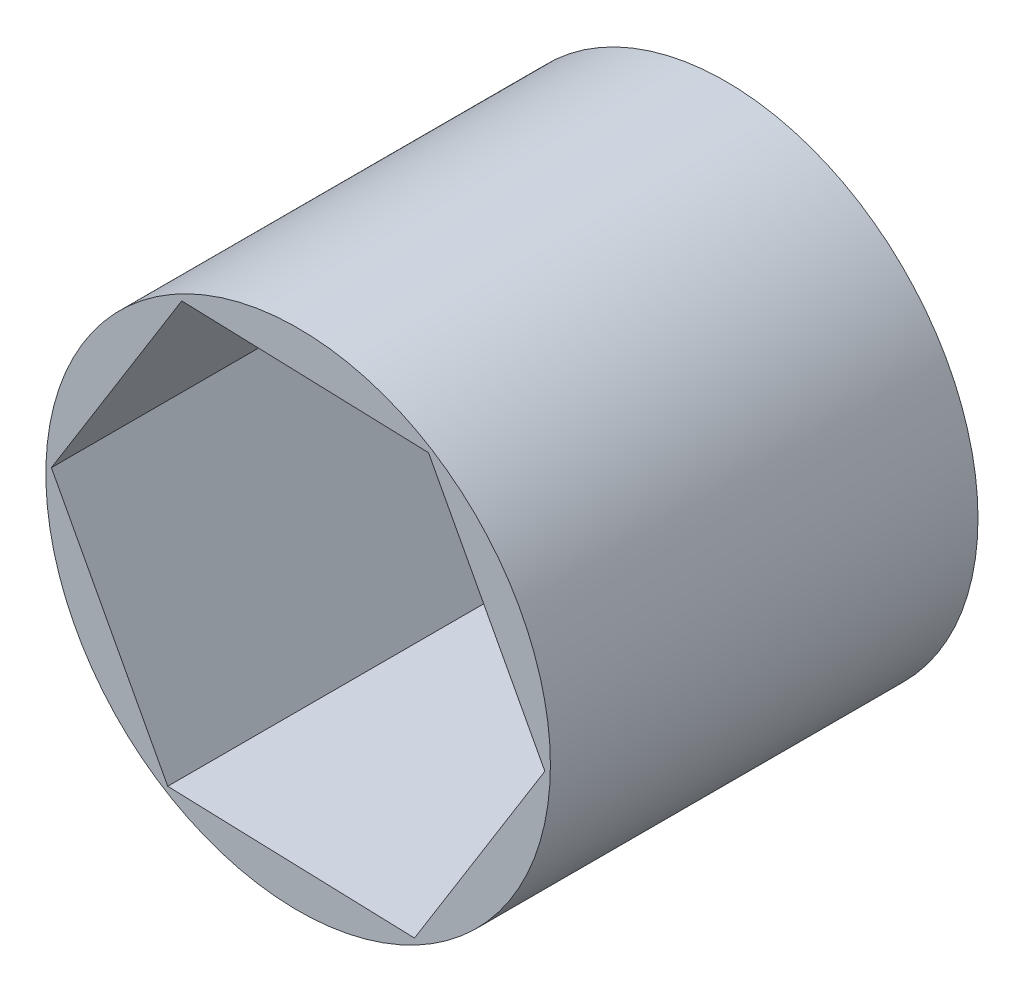
ISO-10303-21;
HEADER;
FILE_DESCRIPTION(('STEP AP214'),'2;1');
FILE_NAME('part.step','',(''),(''),'','','');
FILE_SCHEMA(('AUTOMOTIVE_DESIGN { 1 0 10303 214 1 1 1 1 }'));
ENDSEC;
DATA;
#1=APPLICATION_CONTEXT('core data for automotive mechanical design processes');
#2=APPLICATION_PROTOCOL_DEFINITION('international standard','automotive_design',2000,#1);
#3=PRODUCT_CONTEXT('',#1,'mechanical');
#4=PRODUCT('Part','Part','',(#3));
#5=PRODUCT_RELATED_PRODUCT_CATEGORY('part','',(#4));
#6=PRODUCT_DEFINITION_FORMATION('','',#4);
#7=PRODUCT_DEFINITION_CONTEXT('part definition',#1,'design');
#8=PRODUCT_DEFINITION('design','',#6,#7);
#9=PRODUCT_DEFINITION_SHAPE('','',#8);
#10=(LENGTH_UNIT() NAMED_UNIT(*) SI_UNIT(.MILLI.,.METRE.));
#11=(NAMED_UNIT(*) PLANE_ANGLE_UNIT() SI_UNIT($,.RADIAN.));
#12=(NAMED_UNIT(*) SI_UNIT($,.STERADIAN.) SOLID_ANGLE_UNIT());
#13=UNCERTAINTY_MEASURE_WITH_UNIT(LENGTH_MEASURE(1.E-05),#10,'distance_accuracy_value','');
#14=(GEOMETRIC_REPRESENTATION_CONTEXT(3) GLOBAL_UNCERTAINTY_ASSIGNED_CONTEXT((#13)) GLOBAL_UNIT_ASSIGNED_CONTEXT((#10,
#11,#12)) REPRESENTATION_CONTEXT('',''));
#15=CARTESIAN_POINT('',(0.,0.,0.));
#16=DIRECTION('',(0.,0.,1.));
#17=DIRECTION('',(1.,0.,0.));
#18=AXIS2_PLACEMENT_3D('',#15,#16,#17);
#19=CARTESIAN_POINT('',(0.,0.,12.7));
#20=DIRECTION('',(0.,0.,1.));
#21=DIRECTION('',(1.,0.,0.));
#22=AXIS2_PLACEMENT_3D('',#19,#20,#21);
#23=PLANE('',#22);
#24=CARTESIAN_POINT('',(0.,0.,12.7));
#25=DIRECTION('',(0.,0.,1.));
#26=DIRECTION('',(1.,0.,0.));
#27=AXIS2_PLACEMENT_3D('',#24,#25,#26);
#28=CIRCLE('',#27,7.493);
#29=CARTESIAN_POINT('',(7.493,0.,12.7));
#30=VERTEX_POINT('',#29);
#31=EDGE_CURVE('E11',#30,#30,#28,.T.);
#32=ORIENTED_EDGE('',*,*,#31,.T.);
#33=EDGE_LOOP('',(#32));
#34=FACE_BOUND('',#33,.T.);
#35=DIRECTION('',(-0.999461959203854,0.0327992698759279,0.));
#36=VECTOR('',#35,1.);
#37=CARTESIAN_POINT('',(3.87247702177585,6.2263356036397,12.7));
#38=LINE('',#37,#36);
#39=CARTESIAN_POINT('',(3.87247702177585,6.2263356036397,12.7));
#40=VERTEX_POINT('',#39);
#41=CARTESIAN_POINT('',(-3.45592629435157,6.46683127824924,12.7));
#42=VERTEX_POINT('',#41);
#43=EDGE_CURVE('E94',#40,#42,#38,.T.);
#44=ORIENTED_EDGE('',*,*,#43,.F.);
#45=DIRECTION('',(-0.471325978663792,0.881959081724667,0.));
#46=VECTOR('',#45,1.);
#47=CARTESIAN_POINT('',(7.32840331612742,-0.240495674609544,12.7));
#48=LINE('',#47,#46);
#49=CARTESIAN_POINT('',(7.32840331612742,-0.240495674609544,12.7));
#50=VERTEX_POINT('',#49);
#51=EDGE_CURVE('E86',#50,#40,#48,.T.);
#52=ORIENTED_EDGE('',*,*,#51,.F.);
#53=DIRECTION('',(0.528135980540062,0.84915981184874,0.));
#54=VECTOR('',#53,1.);
#55=CARTESIAN_POINT('',(3.45592629435157,-6.46683127824924,12.7));
#56=LINE('',#55,#54);
#57=CARTESIAN_POINT('',(3.45592629435157,-6.46683127824924,12.7));
#58=VERTEX_POINT('',#57);
#59=EDGE_CURVE('E114',#58,#50,#56,.T.);
#60=ORIENTED_EDGE('',*,*,#59,.F.);
#61=DIRECTION('',(0.999461959203854,-0.0327992698759277,0.));
#62=VECTOR('',#61,1.);
#63=CARTESIAN_POINT('',(-3.87247702177585,-6.2263356036397,12.7));
#64=LINE('',#63,#62);
#65=CARTESIAN_POINT('',(-3.87247702177585,-6.2263356036397,12.7));
#66=VERTEX_POINT('',#65);
#67=EDGE_CURVE('E112',#66,#58,#64,.T.);
#68=ORIENTED_EDGE('',*,*,#67,.F.);
#69=DIRECTION('',(0.471325978663792,-0.881959081724667,0.));
#70=VECTOR('',#69,1.);
#71=CARTESIAN_POINT('',(-7.32840331612743,0.240495674609547,12.7));
#72=LINE('',#71,#70);
#73=CARTESIAN_POINT('',(-7.32840331612743,0.240495674609547,12.7));
#74=VERTEX_POINT('',#73);
#75=EDGE_CURVE('E108',#74,#66,#72,.T.);
#76=ORIENTED_EDGE('',*,*,#75,.F.);
#77=DIRECTION('',(-0.528135980540062,-0.84915981184874,0.));
#78=VECTOR('',#77,1.);
#79=CARTESIAN_POINT('',(-3.45592629435157,6.46683127824924,12.7));
#80=LINE('',#79,#78);
#81=EDGE_CURVE('E106',#42,#74,#80,.T.);
#82=ORIENTED_EDGE('',*,*,#81,.F.);
#83=EDGE_LOOP('',(#44,#52,#60,#68,#76,#82));
#84=FACE_BOUND('',#83,.T.);
#85=ADVANCED_FACE('F33',(#34,#84),#23,.T.);
#86=CARTESIAN_POINT('',(0.,0.,0.));
#87=DIRECTION('',(0.,0.,1.));
#88=DIRECTION('',(1.,0.,0.));
#89=AXIS2_PLACEMENT_3D('',#86,#87,#88);
#90=PLANE('',#89);
#91=CARTESIAN_POINT('',(0.,0.,0.));
#92=DIRECTION('',(0.,0.,1.));
#93=DIRECTION('',(1.,0.,0.));
#94=AXIS2_PLACEMENT_3D('',#91,#92,#93);
#95=CIRCLE('',#94,7.493);
#96=CARTESIAN_POINT('',(7.493,0.,0.));
#97=VERTEX_POINT('',#96);
#98=EDGE_CURVE('E37',#97,#97,#95,.T.);
#99=ORIENTED_EDGE('',*,*,#98,.F.);
#100=EDGE_LOOP('',(#99));
#101=FACE_BOUND('',#100,.T.);
#102=DIRECTION('',(-0.471325978663792,0.881959081724667,0.));
#103=VECTOR('',#102,1.);
#104=CARTESIAN_POINT('',(7.32840331612742,-0.240495674609544,0.));
#105=LINE('',#104,#103);
#106=CARTESIAN_POINT('',(7.32840331612742,-0.240495674609543,0.));
#107=VERTEX_POINT('',#106);
#108=CARTESIAN_POINT('',(3.87247702177585,6.2263356036397,0.));
#109=VERTEX_POINT('',#108);
#110=EDGE_CURVE('E56',#107,#109,#105,.T.);
#111=ORIENTED_EDGE('',*,*,#110,.T.);
#112=DIRECTION('',(-0.999461959203854,0.0327992698759279,0.));
#113=VECTOR('',#112,1.);
#114=CARTESIAN_POINT('',(3.87247702177585,6.2263356036397,0.));
#115=LINE('',#114,#113);
#116=CARTESIAN_POINT('',(-3.45592629435157,6.46683127824924,0.));
#117=VERTEX_POINT('',#116);
#118=EDGE_CURVE('E101',#109,#117,#115,.T.);
#119=ORIENTED_EDGE('',*,*,#118,.T.);
#120=DIRECTION('',(-0.528135980540062,-0.84915981184874,0.));
#121=VECTOR('',#120,1.);
#122=CARTESIAN_POINT('',(-3.45592629435157,6.46683127824924,0.));
#123=LINE('',#122,#121);
#124=CARTESIAN_POINT('',(-7.32840331612743,0.240495674609547,0.));
#125=VERTEX_POINT('',#124);
#126=EDGE_CURVE('E118',#117,#125,#123,.T.);
#127=ORIENTED_EDGE('',*,*,#126,.T.);
#128=DIRECTION('',(0.471325978663792,-0.881959081724667,0.));
#129=VECTOR('',#128,1.);
#130=CARTESIAN_POINT('',(-7.32840331612743,0.240495674609547,0.));
#131=LINE('',#130,#129);
#132=CARTESIAN_POINT('',(-3.87247702177585,-6.2263356036397,0.));
#133=VERTEX_POINT('',#132);
#134=EDGE_CURVE('E121',#125,#133,#131,.T.);
#135=ORIENTED_EDGE('',*,*,#134,.T.);
#136=DIRECTION('',(0.999461959203854,-0.0327992698759277,0.));
#137=VECTOR('',#136,1.);
#138=CARTESIAN_POINT('',(-3.87247702177585,-6.2263356036397,0.));
#139=LINE('',#138,#137);
#140=CARTESIAN_POINT('',(3.45592629435157,-6.46683127824924,0.));
#141=VERTEX_POINT('',#140);
#142=EDGE_CURVE('E124',#133,#141,#139,.T.);
#143=ORIENTED_EDGE('',*,*,#142,.T.);
#144=DIRECTION('',(0.528135980540062,0.84915981184874,0.));
#145=VECTOR('',#144,1.);
#146=CARTESIAN_POINT('',(3.45592629435157,-6.46683127824924,0.));
#147=LINE('',#146,#145);
#148=EDGE_CURVE('E95',#141,#107,#147,.T.);
#149=ORIENTED_EDGE('',*,*,#148,.T.);
#150=EDGE_LOOP('',(#111,#119,#127,#135,#143,#149));
#151=FACE_BOUND('',#150,.T.);
#152=ADVANCED_FACE('F141',(#101,#151),#90,.F.);
#153=CARTESIAN_POINT('',(0.,0.,12.7));
#154=DIRECTION('',(0.,0.,-1.));
#155=DIRECTION('',(-1.,0.,0.));
#156=AXIS2_PLACEMENT_3D('',#153,#154,#155);
#157=CYLINDRICAL_SURFACE('',#156,7.493);
#158=ORIENTED_EDGE('',*,*,#31,.F.);
#159=EDGE_LOOP('',(#158));
#160=FACE_BOUND('',#159,.T.);
#161=ORIENTED_EDGE('',*,*,#98,.T.);
#162=EDGE_LOOP('',(#161));
#163=FACE_BOUND('',#162,.T.);
#164=ADVANCED_FACE('F35',(#160,#163),#157,.T.);
#165=CARTESIAN_POINT('',(7.32840331612742,-0.240495674609544,12.7));
#166=DIRECTION('',(-0.881959081724668,-0.471325978663792,0.));
#167=DIRECTION('',(0.471325978663792,-0.881959081724668,0.));
#168=AXIS2_PLACEMENT_3D('',#165,#166,#167);
#169=PLANE('',#168);
#170=ORIENTED_EDGE('',*,*,#110,.F.);
#171=DIRECTION('',(0.,0.,-1.));
#172=VECTOR('',#171,1.);
#173=CARTESIAN_POINT('',(7.32840331612742,-0.240495674609544,12.7));
#174=LINE('',#173,#172);
#175=EDGE_CURVE('E90',#50,#107,#174,.T.);
#176=ORIENTED_EDGE('',*,*,#175,.F.);
#177=ORIENTED_EDGE('',*,*,#51,.T.);
#178=DIRECTION('',(0.,0.,-1.));
#179=VECTOR('',#178,1.);
#180=CARTESIAN_POINT('',(3.87247702177585,6.2263356036397,12.7));
#181=LINE('',#180,#179);
#182=EDGE_CURVE('E89',#40,#109,#181,.T.);
#183=ORIENTED_EDGE('',*,*,#182,.T.);
#184=EDGE_LOOP('',(#170,#176,#177,#183));
#185=FACE_BOUND('',#184,.T.);
#186=ADVANCED_FACE('F88',(#185),#169,.T.);
#187=CARTESIAN_POINT('',(3.87247702177585,6.2263356036397,12.7));
#188=DIRECTION('',(-0.0327992698759279,-0.999461959203854,0.));
#189=DIRECTION('',(0.999461959203854,-0.0327992698759279,0.));
#190=AXIS2_PLACEMENT_3D('',#187,#188,#189);
#191=PLANE('',#190);
#192=ORIENTED_EDGE('',*,*,#118,.F.);
#193=ORIENTED_EDGE('',*,*,#182,.F.);
#194=ORIENTED_EDGE('',*,*,#43,.T.);
#195=DIRECTION('',(0.,0.,-1.));
#196=VECTOR('',#195,1.);
#197=CARTESIAN_POINT('',(-3.45592629435157,6.46683127824924,12.7));
#198=LINE('',#197,#196);
#199=EDGE_CURVE('E102',#42,#117,#198,.T.);
#200=ORIENTED_EDGE('',*,*,#199,.T.);
#201=EDGE_LOOP('',(#192,#193,#194,#200));
#202=FACE_BOUND('',#201,.T.);
#203=ADVANCED_FACE('F98',(#202),#191,.T.);
#204=CARTESIAN_POINT('',(-3.45592629435157,6.46683127824924,12.7));
#205=DIRECTION('',(0.84915981184874,-0.528135980540062,0.));
#206=DIRECTION('',(0.528135980540062,0.84915981184874,0.));
#207=AXIS2_PLACEMENT_3D('',#204,#205,#206);
#208=PLANE('',#207);
#209=ORIENTED_EDGE('',*,*,#126,.F.);
#210=ORIENTED_EDGE('',*,*,#199,.F.);
#211=ORIENTED_EDGE('',*,*,#81,.T.);
#212=DIRECTION('',(0.,0.,-1.));
#213=VECTOR('',#212,1.);
#214=CARTESIAN_POINT('',(-7.32840331612743,0.240495674609547,12.7));
#215=LINE('',#214,#213);
#216=EDGE_CURVE('E133',#74,#125,#215,.T.);
#217=ORIENTED_EDGE('',*,*,#216,.T.);
#218=EDGE_LOOP('',(#209,#210,#211,#217));
#219=FACE_BOUND('',#218,.T.);
#220=ADVANCED_FACE('F137',(#219),#208,.T.);
#221=CARTESIAN_POINT('',(-7.32840331612743,0.240495674609547,12.7));
#222=DIRECTION('',(0.881959081724667,0.471325978663792,0.));
#223=DIRECTION('',(-0.471325978663792,0.881959081724668,0.));
#224=AXIS2_PLACEMENT_3D('',#221,#222,#223);
#225=PLANE('',#224);
#226=ORIENTED_EDGE('',*,*,#134,.F.);
#227=ORIENTED_EDGE('',*,*,#216,.F.);
#228=ORIENTED_EDGE('',*,*,#75,.T.);
#229=DIRECTION('',(0.,0.,-1.));
#230=VECTOR('',#229,1.);
#231=CARTESIAN_POINT('',(-3.87247702177585,-6.2263356036397,12.7));
#232=LINE('',#231,#230);
#233=EDGE_CURVE('E131',#66,#133,#232,.T.);
#234=ORIENTED_EDGE('',*,*,#233,.T.);
#235=EDGE_LOOP('',(#226,#227,#228,#234));
#236=FACE_BOUND('',#235,.T.);
#237=ADVANCED_FACE('F149',(#236),#225,.T.);
#238=CARTESIAN_POINT('',(-3.87247702177585,-6.2263356036397,12.7));
#239=DIRECTION('',(0.0327992698759277,0.999461959203854,0.));
#240=DIRECTION('',(-0.999461959203854,0.0327992698759277,0.));
#241=AXIS2_PLACEMENT_3D('',#238,#239,#240);
#242=PLANE('',#241);
#243=ORIENTED_EDGE('',*,*,#142,.F.);
#244=ORIENTED_EDGE('',*,*,#233,.F.);
#245=ORIENTED_EDGE('',*,*,#67,.T.);
#246=DIRECTION('',(0.,0.,-1.));
#247=VECTOR('',#246,1.);
#248=CARTESIAN_POINT('',(3.45592629435157,-6.46683127824924,12.7));
#249=LINE('',#248,#247);
#250=EDGE_CURVE('E48',#58,#141,#249,.T.);
#251=ORIENTED_EDGE('',*,*,#250,.T.);
#252=EDGE_LOOP('',(#243,#244,#245,#251));
#253=FACE_BOUND('',#252,.T.);
#254=ADVANCED_FACE('F147',(#253),#242,.T.);
#255=CARTESIAN_POINT('',(3.45592629435157,-6.46683127824924,12.7));
#256=DIRECTION('',(-0.84915981184874,0.528135980540062,0.));
#257=DIRECTION('',(-0.528135980540062,-0.84915981184874,0.));
#258=AXIS2_PLACEMENT_3D('',#255,#256,#257);
#259=PLANE('',#258);
#260=ORIENTED_EDGE('',*,*,#148,.F.);
#261=ORIENTED_EDGE('',*,*,#250,.F.);
#262=ORIENTED_EDGE('',*,*,#59,.T.);
#263=ORIENTED_EDGE('',*,*,#175,.T.);
#264=EDGE_LOOP('',(#260,#261,#262,#263));
#265=FACE_BOUND('',#264,.T.);
#266=ADVANCED_FACE('F143',(#265),#259,.T.);
#267=CLOSED_SHELL('',(#85,#152,#164,#186,#203,#220,#237,#254,#266));
#268=MANIFOLD_SOLID_BREP('B2',#267);
#269=ADVANCED_BREP_SHAPE_REPRESENTATION('',(#18,#268),#14);
#270=SHAPE_DEFINITION_REPRESENTATION(#9,#269);
ENDSEC;
END-ISO-10303-21;
